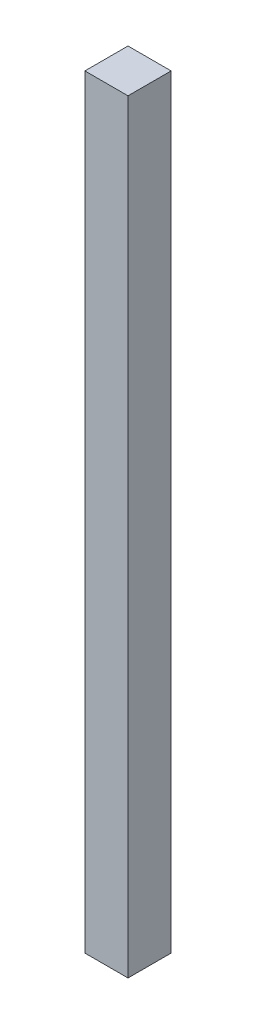
ISO-10303-21;
HEADER;
FILE_DESCRIPTION(('STEP AP214'),'2;1');
FILE_NAME('part.step','',(''),(''),'','','');
FILE_SCHEMA(('AUTOMOTIVE_DESIGN { 1 0 10303 214 1 1 1 1 }'));
ENDSEC;
DATA;
#1=APPLICATION_CONTEXT('core data for automotive mechanical design processes');
#2=APPLICATION_PROTOCOL_DEFINITION('international standard','automotive_design',2000,#1);
#3=PRODUCT_CONTEXT('',#1,'mechanical');
#4=PRODUCT('Part','Part','',(#3));
#5=PRODUCT_RELATED_PRODUCT_CATEGORY('part','',(#4));
#6=PRODUCT_DEFINITION_FORMATION('','',#4);
#7=PRODUCT_DEFINITION_CONTEXT('part definition',#1,'design');
#8=PRODUCT_DEFINITION('design','',#6,#7);
#9=PRODUCT_DEFINITION_SHAPE('','',#8);
#10=(LENGTH_UNIT() NAMED_UNIT(*) SI_UNIT(.MILLI.,.METRE.));
#11=(NAMED_UNIT(*) PLANE_ANGLE_UNIT() SI_UNIT($,.RADIAN.));
#12=(NAMED_UNIT(*) SI_UNIT($,.STERADIAN.) SOLID_ANGLE_UNIT());
#13=UNCERTAINTY_MEASURE_WITH_UNIT(LENGTH_MEASURE(1.E-05),#10,'distance_accuracy_value','');
#14=(GEOMETRIC_REPRESENTATION_CONTEXT(3) GLOBAL_UNCERTAINTY_ASSIGNED_CONTEXT((#13)) GLOBAL_UNIT_ASSIGNED_CONTEXT((#10,
#11,#12)) REPRESENTATION_CONTEXT('',''));
#15=CARTESIAN_POINT('',(0.,0.,0.));
#16=DIRECTION('',(0.,0.,1.));
#17=DIRECTION('',(1.,0.,0.));
#18=AXIS2_PLACEMENT_3D('',#15,#16,#17);
#19=CARTESIAN_POINT('',(0.,450.,0.));
#20=DIRECTION('',(1.,0.,0.));
#21=DIRECTION('',(0.,0.,-1.));
#22=AXIS2_PLACEMENT_3D('',#19,#20,#21);
#23=PLANE('',#22);
#24=DIRECTION('',(0.,0.,1.));
#25=VECTOR('',#24,1.);
#26=CARTESIAN_POINT('',(0.,0.,0.));
#27=LINE('',#26,#25);
#28=CARTESIAN_POINT('',(0.,0.,-25.4));
#29=VERTEX_POINT('',#28);
#30=CARTESIAN_POINT('',(0.,0.,0.));
#31=VERTEX_POINT('',#30);
#32=EDGE_CURVE('E111',#29,#31,#27,.T.);
#33=ORIENTED_EDGE('',*,*,#32,.T.);
#34=DIRECTION('',(0.,-1.,0.));
#35=VECTOR('',#34,1.);
#36=CARTESIAN_POINT('',(0.,450.,0.));
#37=LINE('',#36,#35);
#38=CARTESIAN_POINT('',(0.,450.,0.));
#39=VERTEX_POINT('',#38);
#40=EDGE_CURVE('E11',#39,#31,#37,.T.);
#41=ORIENTED_EDGE('',*,*,#40,.F.);
#42=DIRECTION('',(0.,0.,1.));
#43=VECTOR('',#42,1.);
#44=CARTESIAN_POINT('',(0.,450.,0.));
#45=LINE('',#44,#43);
#46=CARTESIAN_POINT('',(0.,450.,-25.4));
#47=VERTEX_POINT('',#46);
#48=EDGE_CURVE('E95',#47,#39,#45,.T.);
#49=ORIENTED_EDGE('',*,*,#48,.F.);
#50=DIRECTION('',(0.,-1.,0.));
#51=VECTOR('',#50,1.);
#52=CARTESIAN_POINT('',(0.,450.,-25.4));
#53=LINE('',#52,#51);
#54=EDGE_CURVE('E107',#47,#29,#53,.T.);
#55=ORIENTED_EDGE('',*,*,#54,.T.);
#56=EDGE_LOOP('',(#33,#41,#49,#55));
#57=FACE_BOUND('',#56,.T.);
#58=ADVANCED_FACE('F43',(#57),#23,.F.);
#59=CARTESIAN_POINT('',(0.,450.,0.));
#60=DIRECTION('',(0.,0.,-1.));
#61=DIRECTION('',(-1.,0.,0.));
#62=AXIS2_PLACEMENT_3D('',#59,#60,#61);
#63=PLANE('',#62);
#64=DIRECTION('',(1.,0.,0.));
#65=VECTOR('',#64,1.);
#66=CARTESIAN_POINT('',(0.,0.,0.));
#67=LINE('',#66,#65);
#68=CARTESIAN_POINT('',(25.4,0.,0.));
#69=VERTEX_POINT('',#68);
#70=EDGE_CURVE('E100',#31,#69,#67,.T.);
#71=ORIENTED_EDGE('',*,*,#70,.T.);
#72=DIRECTION('',(0.,-1.,0.));
#73=VECTOR('',#72,1.);
#74=CARTESIAN_POINT('',(25.4,450.,0.));
#75=LINE('',#74,#73);
#76=CARTESIAN_POINT('',(25.4,450.,0.));
#77=VERTEX_POINT('',#76);
#78=EDGE_CURVE('E52',#77,#69,#75,.T.);
#79=ORIENTED_EDGE('',*,*,#78,.F.);
#80=DIRECTION('',(1.,0.,0.));
#81=VECTOR('',#80,1.);
#82=CARTESIAN_POINT('',(0.,450.,0.));
#83=LINE('',#82,#81);
#84=EDGE_CURVE('E90',#39,#77,#83,.T.);
#85=ORIENTED_EDGE('',*,*,#84,.F.);
#86=ORIENTED_EDGE('',*,*,#40,.T.);
#87=EDGE_LOOP('',(#71,#79,#85,#86));
#88=FACE_BOUND('',#87,.T.);
#89=ADVANCED_FACE('F99',(#88),#63,.F.);
#90=CARTESIAN_POINT('',(25.4,450.,0.));
#91=DIRECTION('',(-1.,0.,0.));
#92=DIRECTION('',(0.,0.,1.));
#93=AXIS2_PLACEMENT_3D('',#90,#91,#92);
#94=PLANE('',#93);
#95=DIRECTION('',(0.,0.,-1.));
#96=VECTOR('',#95,1.);
#97=CARTESIAN_POINT('',(25.4,0.,0.));
#98=LINE('',#97,#96);
#99=CARTESIAN_POINT('',(25.4,0.,-25.4));
#100=VERTEX_POINT('',#99);
#101=EDGE_CURVE('E77',#69,#100,#98,.T.);
#102=ORIENTED_EDGE('',*,*,#101,.T.);
#103=DIRECTION('',(0.,-1.,0.));
#104=VECTOR('',#103,1.);
#105=CARTESIAN_POINT('',(25.4,450.,-25.4));
#106=LINE('',#105,#104);
#107=CARTESIAN_POINT('',(25.4,450.,-25.4));
#108=VERTEX_POINT('',#107);
#109=EDGE_CURVE('E102',#108,#100,#106,.T.);
#110=ORIENTED_EDGE('',*,*,#109,.F.);
#111=DIRECTION('',(0.,0.,-1.));
#112=VECTOR('',#111,1.);
#113=CARTESIAN_POINT('',(25.4,450.,0.));
#114=LINE('',#113,#112);
#115=EDGE_CURVE('E93',#77,#108,#114,.T.);
#116=ORIENTED_EDGE('',*,*,#115,.F.);
#117=ORIENTED_EDGE('',*,*,#78,.T.);
#118=EDGE_LOOP('',(#102,#110,#116,#117));
#119=FACE_BOUND('',#118,.T.);
#120=ADVANCED_FACE('F103',(#119),#94,.F.);
#121=CARTESIAN_POINT('',(0.,450.,-25.4));
#122=DIRECTION('',(0.,0.,1.));
#123=DIRECTION('',(1.,0.,0.));
#124=AXIS2_PLACEMENT_3D('',#121,#122,#123);
#125=PLANE('',#124);
#126=DIRECTION('',(-1.,0.,0.));
#127=VECTOR('',#126,1.);
#128=CARTESIAN_POINT('',(0.,0.,-25.4));
#129=LINE('',#128,#127);
#130=EDGE_CURVE('E83',#100,#29,#129,.T.);
#131=ORIENTED_EDGE('',*,*,#130,.T.);
#132=ORIENTED_EDGE('',*,*,#54,.F.);
#133=DIRECTION('',(-1.,0.,0.));
#134=VECTOR('',#133,1.);
#135=CARTESIAN_POINT('',(0.,450.,-25.4));
#136=LINE('',#135,#134);
#137=EDGE_CURVE('E60',#108,#47,#136,.T.);
#138=ORIENTED_EDGE('',*,*,#137,.F.);
#139=ORIENTED_EDGE('',*,*,#109,.T.);
#140=EDGE_LOOP('',(#131,#132,#138,#139));
#141=FACE_BOUND('',#140,.T.);
#142=ADVANCED_FACE('F124',(#141),#125,.F.);
#143=CARTESIAN_POINT('',(0.,450.,0.));
#144=DIRECTION('',(0.,-1.,0.));
#145=DIRECTION('',(0.,0.,-1.));
#146=AXIS2_PLACEMENT_3D('',#143,#144,#145);
#147=PLANE('',#146);
#148=ORIENTED_EDGE('',*,*,#48,.T.);
#149=ORIENTED_EDGE('',*,*,#84,.T.);
#150=ORIENTED_EDGE('',*,*,#115,.T.);
#151=ORIENTED_EDGE('',*,*,#137,.T.);
#152=EDGE_LOOP('',(#148,#149,#150,#151));
#153=FACE_BOUND('',#152,.T.);
#154=ADVANCED_FACE('F91',(#153),#147,.F.);
#155=CARTESIAN_POINT('',(0.,0.,0.));
#156=DIRECTION('',(0.,-1.,0.));
#157=DIRECTION('',(0.,0.,-1.));
#158=AXIS2_PLACEMENT_3D('',#155,#156,#157);
#159=PLANE('',#158);
#160=ORIENTED_EDGE('',*,*,#32,.F.);
#161=ORIENTED_EDGE('',*,*,#130,.F.);
#162=ORIENTED_EDGE('',*,*,#101,.F.);
#163=ORIENTED_EDGE('',*,*,#70,.F.);
#164=EDGE_LOOP('',(#160,#161,#162,#163));
#165=FACE_BOUND('',#164,.T.);
#166=ADVANCED_FACE('F127',(#165),#159,.T.);
#167=CLOSED_SHELL('',(#58,#89,#120,#142,#154,#166));
#168=MANIFOLD_SOLID_BREP('B2',#167);
#169=ADVANCED_BREP_SHAPE_REPRESENTATION('',(#18,#168),#14);
#170=SHAPE_DEFINITION_REPRESENTATION(#9,#169);
ENDSEC;
END-ISO-10303-21;
